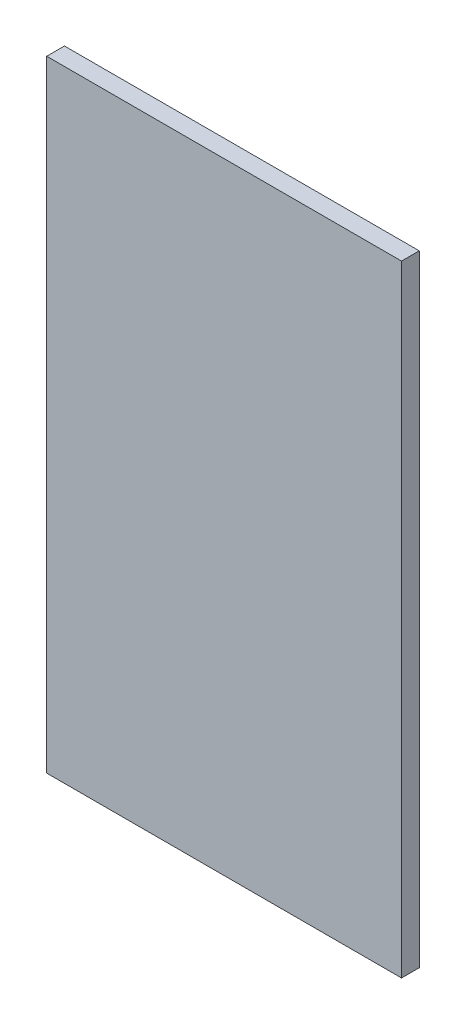
ISO-10303-21;
HEADER;
FILE_DESCRIPTION(('STEP AP214'),'2;1');
FILE_NAME('part.step','',(''),(''),'','','');
FILE_SCHEMA(('AUTOMOTIVE_DESIGN { 1 0 10303 214 1 1 1 1 }'));
ENDSEC;
DATA;
#1=APPLICATION_CONTEXT('core data for automotive mechanical design processes');
#2=APPLICATION_PROTOCOL_DEFINITION('international standard','automotive_design',2000,#1);
#3=PRODUCT_CONTEXT('',#1,'mechanical');
#4=PRODUCT('Part','Part','',(#3));
#5=PRODUCT_RELATED_PRODUCT_CATEGORY('part','',(#4));
#6=PRODUCT_DEFINITION_FORMATION('','',#4);
#7=PRODUCT_DEFINITION_CONTEXT('part definition',#1,'design');
#8=PRODUCT_DEFINITION('design','',#6,#7);
#9=PRODUCT_DEFINITION_SHAPE('','',#8);
#10=(LENGTH_UNIT() NAMED_UNIT(*) SI_UNIT(.MILLI.,.METRE.));
#11=(NAMED_UNIT(*) PLANE_ANGLE_UNIT() SI_UNIT($,.RADIAN.));
#12=(NAMED_UNIT(*) SI_UNIT($,.STERADIAN.) SOLID_ANGLE_UNIT());
#13=UNCERTAINTY_MEASURE_WITH_UNIT(LENGTH_MEASURE(1.E-05),#10,'distance_accuracy_value','');
#14=(GEOMETRIC_REPRESENTATION_CONTEXT(3) GLOBAL_UNCERTAINTY_ASSIGNED_CONTEXT((#13)) GLOBAL_UNIT_ASSIGNED_CONTEXT((#10,
#11,#12)) REPRESENTATION_CONTEXT('',''));
#15=CARTESIAN_POINT('',(0.,0.,0.));
#16=DIRECTION('',(0.,0.,1.));
#17=DIRECTION('',(1.,0.,0.));
#18=AXIS2_PLACEMENT_3D('',#15,#16,#17);
#19=CARTESIAN_POINT('',(0.,0.,20.));
#20=DIRECTION('',(1.,0.,0.));
#21=DIRECTION('',(0.,0.,-1.));
#22=AXIS2_PLACEMENT_3D('',#19,#20,#21);
#23=PLANE('',#22);
#24=DIRECTION('',(0.,-1.,0.));
#25=VECTOR('',#24,1.);
#26=CARTESIAN_POINT('',(0.,0.,0.));
#27=LINE('',#26,#25);
#28=CARTESIAN_POINT('',(0.,700.,0.));
#29=VERTEX_POINT('',#28);
#30=CARTESIAN_POINT('',(0.,0.,0.));
#31=VERTEX_POINT('',#30);
#32=EDGE_CURVE('E111',#29,#31,#27,.T.);
#33=ORIENTED_EDGE('',*,*,#32,.T.);
#34=DIRECTION('',(0.,0.,-1.));
#35=VECTOR('',#34,1.);
#36=CARTESIAN_POINT('',(0.,0.,20.));
#37=LINE('',#36,#35);
#38=CARTESIAN_POINT('',(0.,0.,20.));
#39=VERTEX_POINT('',#38);
#40=EDGE_CURVE('E11',#39,#31,#37,.T.);
#41=ORIENTED_EDGE('',*,*,#40,.F.);
#42=DIRECTION('',(0.,-1.,0.));
#43=VECTOR('',#42,1.);
#44=CARTESIAN_POINT('',(0.,0.,20.));
#45=LINE('',#44,#43);
#46=CARTESIAN_POINT('',(0.,700.,20.));
#47=VERTEX_POINT('',#46);
#48=EDGE_CURVE('E95',#47,#39,#45,.T.);
#49=ORIENTED_EDGE('',*,*,#48,.F.);
#50=DIRECTION('',(0.,0.,-1.));
#51=VECTOR('',#50,1.);
#52=CARTESIAN_POINT('',(0.,700.,20.));
#53=LINE('',#52,#51);
#54=EDGE_CURVE('E107',#47,#29,#53,.T.);
#55=ORIENTED_EDGE('',*,*,#54,.T.);
#56=EDGE_LOOP('',(#33,#41,#49,#55));
#57=FACE_BOUND('',#56,.T.);
#58=ADVANCED_FACE('F43',(#57),#23,.F.);
#59=CARTESIAN_POINT('',(0.,0.,20.));
#60=DIRECTION('',(0.,1.,0.));
#61=DIRECTION('',(0.,0.,1.));
#62=AXIS2_PLACEMENT_3D('',#59,#60,#61);
#63=PLANE('',#62);
#64=DIRECTION('',(1.,0.,0.));
#65=VECTOR('',#64,1.);
#66=CARTESIAN_POINT('',(0.,0.,0.));
#67=LINE('',#66,#65);
#68=CARTESIAN_POINT('',(400.,0.,0.));
#69=VERTEX_POINT('',#68);
#70=EDGE_CURVE('E100',#31,#69,#67,.T.);
#71=ORIENTED_EDGE('',*,*,#70,.T.);
#72=DIRECTION('',(0.,0.,-1.));
#73=VECTOR('',#72,1.);
#74=CARTESIAN_POINT('',(400.,0.,20.));
#75=LINE('',#74,#73);
#76=CARTESIAN_POINT('',(400.,0.,20.));
#77=VERTEX_POINT('',#76);
#78=EDGE_CURVE('E52',#77,#69,#75,.T.);
#79=ORIENTED_EDGE('',*,*,#78,.F.);
#80=DIRECTION('',(1.,0.,0.));
#81=VECTOR('',#80,1.);
#82=CARTESIAN_POINT('',(0.,0.,20.));
#83=LINE('',#82,#81);
#84=EDGE_CURVE('E90',#39,#77,#83,.T.);
#85=ORIENTED_EDGE('',*,*,#84,.F.);
#86=ORIENTED_EDGE('',*,*,#40,.T.);
#87=EDGE_LOOP('',(#71,#79,#85,#86));
#88=FACE_BOUND('',#87,.T.);
#89=ADVANCED_FACE('F99',(#88),#63,.F.);
#90=CARTESIAN_POINT('',(400.,0.,20.));
#91=DIRECTION('',(-1.,0.,0.));
#92=DIRECTION('',(0.,0.,1.));
#93=AXIS2_PLACEMENT_3D('',#90,#91,#92);
#94=PLANE('',#93);
#95=DIRECTION('',(0.,1.,0.));
#96=VECTOR('',#95,1.);
#97=CARTESIAN_POINT('',(400.,0.,0.));
#98=LINE('',#97,#96);
#99=CARTESIAN_POINT('',(400.,700.,0.));
#100=VERTEX_POINT('',#99);
#101=EDGE_CURVE('E77',#69,#100,#98,.T.);
#102=ORIENTED_EDGE('',*,*,#101,.T.);
#103=DIRECTION('',(0.,0.,-1.));
#104=VECTOR('',#103,1.);
#105=CARTESIAN_POINT('',(400.,700.,20.));
#106=LINE('',#105,#104);
#107=CARTESIAN_POINT('',(400.,700.,20.));
#108=VERTEX_POINT('',#107);
#109=EDGE_CURVE('E102',#108,#100,#106,.T.);
#110=ORIENTED_EDGE('',*,*,#109,.F.);
#111=DIRECTION('',(0.,1.,0.));
#112=VECTOR('',#111,1.);
#113=CARTESIAN_POINT('',(400.,0.,20.));
#114=LINE('',#113,#112);
#115=EDGE_CURVE('E93',#77,#108,#114,.T.);
#116=ORIENTED_EDGE('',*,*,#115,.F.);
#117=ORIENTED_EDGE('',*,*,#78,.T.);
#118=EDGE_LOOP('',(#102,#110,#116,#117));
#119=FACE_BOUND('',#118,.T.);
#120=ADVANCED_FACE('F103',(#119),#94,.F.);
#121=CARTESIAN_POINT('',(0.,700.,20.));
#122=DIRECTION('',(0.,-1.,0.));
#123=DIRECTION('',(0.,0.,-1.));
#124=AXIS2_PLACEMENT_3D('',#121,#122,#123);
#125=PLANE('',#124);
#126=DIRECTION('',(-1.,0.,0.));
#127=VECTOR('',#126,1.);
#128=CARTESIAN_POINT('',(0.,700.,0.));
#129=LINE('',#128,#127);
#130=EDGE_CURVE('E83',#100,#29,#129,.T.);
#131=ORIENTED_EDGE('',*,*,#130,.T.);
#132=ORIENTED_EDGE('',*,*,#54,.F.);
#133=DIRECTION('',(-1.,0.,0.));
#134=VECTOR('',#133,1.);
#135=CARTESIAN_POINT('',(0.,700.,20.));
#136=LINE('',#135,#134);
#137=EDGE_CURVE('E60',#108,#47,#136,.T.);
#138=ORIENTED_EDGE('',*,*,#137,.F.);
#139=ORIENTED_EDGE('',*,*,#109,.T.);
#140=EDGE_LOOP('',(#131,#132,#138,#139));
#141=FACE_BOUND('',#140,.T.);
#142=ADVANCED_FACE('F124',(#141),#125,.F.);
#143=CARTESIAN_POINT('',(0.,0.,20.));
#144=DIRECTION('',(0.,0.,-1.));
#145=DIRECTION('',(-1.,0.,0.));
#146=AXIS2_PLACEMENT_3D('',#143,#144,#145);
#147=PLANE('',#146);
#148=ORIENTED_EDGE('',*,*,#48,.T.);
#149=ORIENTED_EDGE('',*,*,#84,.T.);
#150=ORIENTED_EDGE('',*,*,#115,.T.);
#151=ORIENTED_EDGE('',*,*,#137,.T.);
#152=EDGE_LOOP('',(#148,#149,#150,#151));
#153=FACE_BOUND('',#152,.T.);
#154=ADVANCED_FACE('F91',(#153),#147,.F.);
#155=CARTESIAN_POINT('',(0.,0.,0.));
#156=DIRECTION('',(0.,0.,-1.));
#157=DIRECTION('',(-1.,0.,0.));
#158=AXIS2_PLACEMENT_3D('',#155,#156,#157);
#159=PLANE('',#158);
#160=ORIENTED_EDGE('',*,*,#32,.F.);
#161=ORIENTED_EDGE('',*,*,#130,.F.);
#162=ORIENTED_EDGE('',*,*,#101,.F.);
#163=ORIENTED_EDGE('',*,*,#70,.F.);
#164=EDGE_LOOP('',(#160,#161,#162,#163));
#165=FACE_BOUND('',#164,.T.);
#166=ADVANCED_FACE('F127',(#165),#159,.T.);
#167=CLOSED_SHELL('',(#58,#89,#120,#142,#154,#166));
#168=MANIFOLD_SOLID_BREP('B2',#167);
#169=ADVANCED_BREP_SHAPE_REPRESENTATION('',(#18,#168),#14);
#170=SHAPE_DEFINITION_REPRESENTATION(#9,#169);
ENDSEC;
END-ISO-10303-21;
